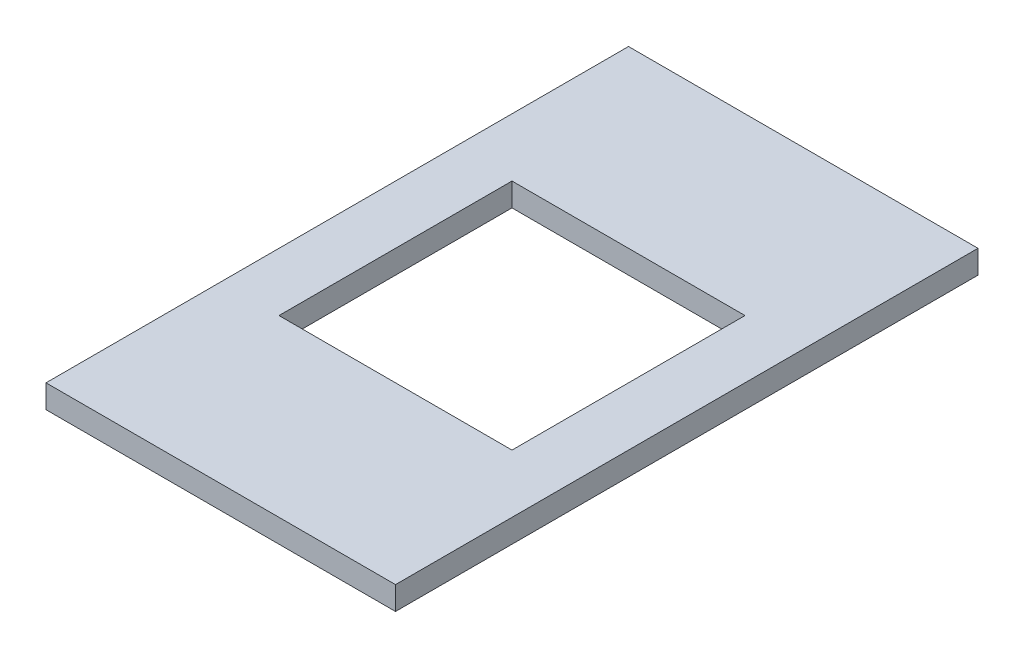
ISO-10303-21;
HEADER;
FILE_DESCRIPTION(('STEP AP214'),'2;1');
FILE_NAME('part.step','',(''),(''),'','','');
FILE_SCHEMA(('AUTOMOTIVE_DESIGN { 1 0 10303 214 1 1 1 1 }'));
ENDSEC;
DATA;
#1=APPLICATION_CONTEXT('core data for automotive mechanical design processes');
#2=APPLICATION_PROTOCOL_DEFINITION('international standard','automotive_design',2000,#1);
#3=PRODUCT_CONTEXT('',#1,'mechanical');
#4=PRODUCT('Part','Part','',(#3));
#5=PRODUCT_RELATED_PRODUCT_CATEGORY('part','',(#4));
#6=PRODUCT_DEFINITION_FORMATION('','',#4);
#7=PRODUCT_DEFINITION_CONTEXT('part definition',#1,'design');
#8=PRODUCT_DEFINITION('design','',#6,#7);
#9=PRODUCT_DEFINITION_SHAPE('','',#8);
#10=(LENGTH_UNIT() NAMED_UNIT(*) SI_UNIT(.MILLI.,.METRE.));
#11=(NAMED_UNIT(*) PLANE_ANGLE_UNIT() SI_UNIT($,.RADIAN.));
#12=(NAMED_UNIT(*) SI_UNIT($,.STERADIAN.) SOLID_ANGLE_UNIT());
#13=UNCERTAINTY_MEASURE_WITH_UNIT(LENGTH_MEASURE(1.E-05),#10,'distance_accuracy_value','');
#14=(GEOMETRIC_REPRESENTATION_CONTEXT(3) GLOBAL_UNCERTAINTY_ASSIGNED_CONTEXT((#13)) GLOBAL_UNIT_ASSIGNED_CONTEXT((#10,
#11,#12)) REPRESENTATION_CONTEXT('',''));
#15=CARTESIAN_POINT('',(0.,0.,0.));
#16=DIRECTION('',(0.,0.,1.));
#17=DIRECTION('',(1.,0.,0.));
#18=AXIS2_PLACEMENT_3D('',#15,#16,#17);
#19=CARTESIAN_POINT('',(0.,10.,0.));
#20=DIRECTION('',(-1.,0.,0.));
#21=DIRECTION('',(0.,0.,1.));
#22=AXIS2_PLACEMENT_3D('',#19,#20,#21);
#23=PLANE('',#22);
#24=DIRECTION('',(0.,0.,1.));
#25=VECTOR('',#24,1.);
#26=CARTESIAN_POINT('',(0.,0.,-140.));
#27=LINE('',#26,#25);
#28=CARTESIAN_POINT('',(0.,0.,-140.));
#29=VERTEX_POINT('',#28);
#30=CARTESIAN_POINT('',(0.,0.,110.));
#31=VERTEX_POINT('',#30);
#32=EDGE_CURVE('E39',#29,#31,#27,.T.);
#33=ORIENTED_EDGE('',*,*,#32,.T.);
#34=DIRECTION('',(0.,1.,0.));
#35=VECTOR('',#34,1.);
#36=CARTESIAN_POINT('',(0.,-10.,110.));
#37=LINE('',#36,#35);
#38=CARTESIAN_POINT('',(0.,-10.,110.));
#39=VERTEX_POINT('',#38);
#40=EDGE_CURVE('E158',#39,#31,#37,.T.);
#41=ORIENTED_EDGE('',*,*,#40,.F.);
#42=DIRECTION('',(0.,0.,1.));
#43=VECTOR('',#42,1.);
#44=CARTESIAN_POINT('',(0.,-10.,-140.));
#45=LINE('',#44,#43);
#46=CARTESIAN_POINT('',(0.,-10.,-140.));
#47=VERTEX_POINT('',#46);
#48=EDGE_CURVE('E144',#47,#39,#45,.T.);
#49=ORIENTED_EDGE('',*,*,#48,.F.);
#50=DIRECTION('',(0.,1.,0.));
#51=VECTOR('',#50,1.);
#52=CARTESIAN_POINT('',(0.,-10.,-140.));
#53=LINE('',#52,#51);
#54=EDGE_CURVE('E155',#47,#29,#53,.T.);
#55=ORIENTED_EDGE('',*,*,#54,.T.);
#56=EDGE_LOOP('',(#33,#41,#49,#55));
#57=FACE_BOUND('',#56,.T.);
#58=ADVANCED_FACE('F36',(#57),#23,.F.);
#59=CARTESIAN_POINT('',(-150.,10.,0.));
#60=DIRECTION('',(1.,0.,0.));
#61=DIRECTION('',(0.,0.,-1.));
#62=AXIS2_PLACEMENT_3D('',#59,#60,#61);
#63=PLANE('',#62);
#64=DIRECTION('',(0.,0.,-1.));
#65=VECTOR('',#64,1.);
#66=CARTESIAN_POINT('',(-150.,0.,-140.));
#67=LINE('',#66,#65);
#68=CARTESIAN_POINT('',(-150.,0.,110.));
#69=VERTEX_POINT('',#68);
#70=CARTESIAN_POINT('',(-150.,0.,-140.));
#71=VERTEX_POINT('',#70);
#72=EDGE_CURVE('E119',#69,#71,#67,.T.);
#73=ORIENTED_EDGE('',*,*,#72,.T.);
#74=DIRECTION('',(0.,1.,0.));
#75=VECTOR('',#74,1.);
#76=CARTESIAN_POINT('',(-150.,-10.,-140.));
#77=LINE('',#76,#75);
#78=CARTESIAN_POINT('',(-150.,-10.,-140.));
#79=VERTEX_POINT('',#78);
#80=EDGE_CURVE('E132',#79,#71,#77,.T.);
#81=ORIENTED_EDGE('',*,*,#80,.F.);
#82=DIRECTION('',(0.,0.,-1.));
#83=VECTOR('',#82,1.);
#84=CARTESIAN_POINT('',(-150.,-10.,-140.));
#85=LINE('',#84,#83);
#86=CARTESIAN_POINT('',(-150.,-10.,110.));
#87=VERTEX_POINT('',#86);
#88=EDGE_CURVE('E138',#87,#79,#85,.T.);
#89=ORIENTED_EDGE('',*,*,#88,.F.);
#90=DIRECTION('',(0.,1.,0.));
#91=VECTOR('',#90,1.);
#92=CARTESIAN_POINT('',(-150.,-10.,110.));
#93=LINE('',#92,#91);
#94=EDGE_CURVE('E148',#87,#69,#93,.T.);
#95=ORIENTED_EDGE('',*,*,#94,.T.);
#96=EDGE_LOOP('',(#73,#81,#89,#95));
#97=FACE_BOUND('',#96,.T.);
#98=ADVANCED_FACE('F180',(#97),#63,.F.);
#99=CARTESIAN_POINT('',(0.,0.,0.));
#100=DIRECTION('',(0.,-1.,0.));
#101=DIRECTION('',(0.,0.,-1.));
#102=AXIS2_PLACEMENT_3D('',#99,#100,#101);
#103=PLANE('',#102);
#104=DIRECTION('',(-1.,0.,0.));
#105=VECTOR('',#104,1.);
#106=CARTESIAN_POINT('',(-125.,0.,35.));
#107=LINE('',#106,#105);
#108=CARTESIAN_POINT('',(-25.,0.,35.));
#109=VERTEX_POINT('',#108);
#110=CARTESIAN_POINT('',(-125.,0.,35.));
#111=VERTEX_POINT('',#110);
#112=EDGE_CURVE('E118',#109,#111,#107,.T.);
#113=ORIENTED_EDGE('',*,*,#112,.T.);
#114=DIRECTION('',(0.,0.,-1.));
#115=VECTOR('',#114,1.);
#116=CARTESIAN_POINT('',(-125.,0.,-65.));
#117=LINE('',#116,#115);
#118=CARTESIAN_POINT('',(-125.,0.,-65.));
#119=VERTEX_POINT('',#118);
#120=EDGE_CURVE('E45',#111,#119,#117,.T.);
#121=ORIENTED_EDGE('',*,*,#120,.T.);
#122=DIRECTION('',(1.,0.,0.));
#123=VECTOR('',#122,1.);
#124=CARTESIAN_POINT('',(-125.,0.,-65.));
#125=LINE('',#124,#123);
#126=CARTESIAN_POINT('',(-25.,0.,-65.));
#127=VERTEX_POINT('',#126);
#128=EDGE_CURVE('E110',#119,#127,#125,.T.);
#129=ORIENTED_EDGE('',*,*,#128,.T.);
#130=DIRECTION('',(0.,0.,1.));
#131=VECTOR('',#130,1.);
#132=CARTESIAN_POINT('',(-25.,0.,-65.));
#133=LINE('',#132,#131);
#134=EDGE_CURVE('E11',#127,#109,#133,.T.);
#135=ORIENTED_EDGE('',*,*,#134,.T.);
#136=EDGE_LOOP('',(#113,#121,#129,#135));
#137=FACE_BOUND('',#136,.T.);
#138=DIRECTION('',(1.,0.,0.));
#139=VECTOR('',#138,1.);
#140=CARTESIAN_POINT('',(0.,0.,-140.));
#141=LINE('',#140,#139);
#142=EDGE_CURVE('E151',#71,#29,#141,.T.);
#143=ORIENTED_EDGE('',*,*,#142,.F.);
#144=ORIENTED_EDGE('',*,*,#72,.F.);
#145=DIRECTION('',(-1.,0.,0.));
#146=VECTOR('',#145,1.);
#147=CARTESIAN_POINT('',(0.,0.,110.));
#148=LINE('',#147,#146);
#149=EDGE_CURVE('E142',#31,#69,#148,.T.);
#150=ORIENTED_EDGE('',*,*,#149,.F.);
#151=ORIENTED_EDGE('',*,*,#32,.F.);
#152=EDGE_LOOP('',(#143,#144,#150,#151));
#153=FACE_BOUND('',#152,.T.);
#154=ADVANCED_FACE('F178',(#137,#153),#103,.F.);
#155=CARTESIAN_POINT('',(0.,-10.,0.));
#156=DIRECTION('',(0.,-1.,0.));
#157=DIRECTION('',(0.,0.,-1.));
#158=AXIS2_PLACEMENT_3D('',#155,#156,#157);
#159=PLANE('',#158);
#160=ORIENTED_EDGE('',*,*,#88,.T.);
#161=DIRECTION('',(1.,0.,0.));
#162=VECTOR('',#161,1.);
#163=CARTESIAN_POINT('',(0.,-10.,-140.));
#164=LINE('',#163,#162);
#165=EDGE_CURVE('E141',#79,#47,#164,.T.);
#166=ORIENTED_EDGE('',*,*,#165,.T.);
#167=ORIENTED_EDGE('',*,*,#48,.T.);
#168=DIRECTION('',(-1.,0.,0.));
#169=VECTOR('',#168,1.);
#170=CARTESIAN_POINT('',(0.,-10.,110.));
#171=LINE('',#170,#169);
#172=EDGE_CURVE('E146',#39,#87,#171,.T.);
#173=ORIENTED_EDGE('',*,*,#172,.T.);
#174=EDGE_LOOP('',(#160,#166,#167,#173));
#175=FACE_BOUND('',#174,.T.);
#176=DIRECTION('',(-1.,0.,0.));
#177=VECTOR('',#176,1.);
#178=CARTESIAN_POINT('',(-125.,-10.,35.));
#179=LINE('',#178,#177);
#180=CARTESIAN_POINT('',(-25.,-10.,35.));
#181=VERTEX_POINT('',#180);
#182=CARTESIAN_POINT('',(-125.,-10.,35.));
#183=VERTEX_POINT('',#182);
#184=EDGE_CURVE('E109',#181,#183,#179,.T.);
#185=ORIENTED_EDGE('',*,*,#184,.F.);
#186=DIRECTION('',(0.,0.,1.));
#187=VECTOR('',#186,1.);
#188=CARTESIAN_POINT('',(-25.,-10.,-65.));
#189=LINE('',#188,#187);
#190=CARTESIAN_POINT('',(-25.,-10.,-65.));
#191=VERTEX_POINT('',#190);
#192=EDGE_CURVE('E101',#191,#181,#189,.T.);
#193=ORIENTED_EDGE('',*,*,#192,.F.);
#194=DIRECTION('',(1.,0.,0.));
#195=VECTOR('',#194,1.);
#196=CARTESIAN_POINT('',(-125.,-10.,-65.));
#197=LINE('',#196,#195);
#198=CARTESIAN_POINT('',(-125.,-10.,-65.));
#199=VERTEX_POINT('',#198);
#200=EDGE_CURVE('E126',#199,#191,#197,.T.);
#201=ORIENTED_EDGE('',*,*,#200,.F.);
#202=DIRECTION('',(0.,0.,-1.));
#203=VECTOR('',#202,1.);
#204=CARTESIAN_POINT('',(-125.,-10.,-65.));
#205=LINE('',#204,#203);
#206=EDGE_CURVE('E124',#183,#199,#205,.T.);
#207=ORIENTED_EDGE('',*,*,#206,.F.);
#208=EDGE_LOOP('',(#185,#193,#201,#207));
#209=FACE_BOUND('',#208,.T.);
#210=ADVANCED_FACE('F123',(#175,#209),#159,.T.);
#211=CARTESIAN_POINT('',(0.,-10.,-140.));
#212=DIRECTION('',(0.,0.,1.));
#213=DIRECTION('',(1.,0.,0.));
#214=AXIS2_PLACEMENT_3D('',#211,#212,#213);
#215=PLANE('',#214);
#216=ORIENTED_EDGE('',*,*,#142,.T.);
#217=ORIENTED_EDGE('',*,*,#54,.F.);
#218=ORIENTED_EDGE('',*,*,#165,.F.);
#219=ORIENTED_EDGE('',*,*,#80,.T.);
#220=EDGE_LOOP('',(#216,#217,#218,#219));
#221=FACE_BOUND('',#220,.T.);
#222=ADVANCED_FACE('F173',(#221),#215,.F.);
#223=CARTESIAN_POINT('',(0.,-10.,110.));
#224=DIRECTION('',(0.,0.,-1.));
#225=DIRECTION('',(-1.,0.,0.));
#226=AXIS2_PLACEMENT_3D('',#223,#224,#225);
#227=PLANE('',#226);
#228=ORIENTED_EDGE('',*,*,#149,.T.);
#229=ORIENTED_EDGE('',*,*,#94,.F.);
#230=ORIENTED_EDGE('',*,*,#172,.F.);
#231=ORIENTED_EDGE('',*,*,#40,.T.);
#232=EDGE_LOOP('',(#228,#229,#230,#231));
#233=FACE_BOUND('',#232,.T.);
#234=ADVANCED_FACE('F183',(#233),#227,.F.);
#235=CARTESIAN_POINT('',(-25.,-10.,-65.));
#236=DIRECTION('',(-1.,0.,0.));
#237=DIRECTION('',(0.,0.,1.));
#238=AXIS2_PLACEMENT_3D('',#235,#236,#237);
#239=PLANE('',#238);
#240=ORIENTED_EDGE('',*,*,#134,.F.);
#241=DIRECTION('',(0.,1.,0.));
#242=VECTOR('',#241,1.);
#243=CARTESIAN_POINT('',(-25.,-10.,-65.));
#244=LINE('',#243,#242);
#245=EDGE_CURVE('E105',#191,#127,#244,.T.);
#246=ORIENTED_EDGE('',*,*,#245,.F.);
#247=ORIENTED_EDGE('',*,*,#192,.T.);
#248=DIRECTION('',(0.,1.,0.));
#249=VECTOR('',#248,1.);
#250=CARTESIAN_POINT('',(-25.,-10.,35.));
#251=LINE('',#250,#249);
#252=EDGE_CURVE('E104',#181,#109,#251,.T.);
#253=ORIENTED_EDGE('',*,*,#252,.T.);
#254=EDGE_LOOP('',(#240,#246,#247,#253));
#255=FACE_BOUND('',#254,.T.);
#256=ADVANCED_FACE('F103',(#255),#239,.T.);
#257=CARTESIAN_POINT('',(-125.,-10.,35.));
#258=DIRECTION('',(0.,0.,-1.));
#259=DIRECTION('',(-1.,0.,0.));
#260=AXIS2_PLACEMENT_3D('',#257,#258,#259);
#261=PLANE('',#260);
#262=ORIENTED_EDGE('',*,*,#112,.F.);
#263=ORIENTED_EDGE('',*,*,#252,.F.);
#264=ORIENTED_EDGE('',*,*,#184,.T.);
#265=DIRECTION('',(0.,1.,0.));
#266=VECTOR('',#265,1.);
#267=CARTESIAN_POINT('',(-125.,-10.,35.));
#268=LINE('',#267,#266);
#269=EDGE_CURVE('E120',#183,#111,#268,.T.);
#270=ORIENTED_EDGE('',*,*,#269,.T.);
#271=EDGE_LOOP('',(#262,#263,#264,#270));
#272=FACE_BOUND('',#271,.T.);
#273=ADVANCED_FACE('F114',(#272),#261,.T.);
#274=CARTESIAN_POINT('',(-125.,-10.,-65.));
#275=DIRECTION('',(1.,0.,0.));
#276=DIRECTION('',(0.,0.,-1.));
#277=AXIS2_PLACEMENT_3D('',#274,#275,#276);
#278=PLANE('',#277);
#279=ORIENTED_EDGE('',*,*,#120,.F.);
#280=ORIENTED_EDGE('',*,*,#269,.F.);
#281=ORIENTED_EDGE('',*,*,#206,.T.);
#282=DIRECTION('',(0.,1.,0.));
#283=VECTOR('',#282,1.);
#284=CARTESIAN_POINT('',(-125.,-10.,-65.));
#285=LINE('',#284,#283);
#286=EDGE_CURVE('E53',#199,#119,#285,.T.);
#287=ORIENTED_EDGE('',*,*,#286,.T.);
#288=EDGE_LOOP('',(#279,#280,#281,#287));
#289=FACE_BOUND('',#288,.T.);
#290=ADVANCED_FACE('F209',(#289),#278,.T.);
#291=CARTESIAN_POINT('',(-125.,-10.,-65.));
#292=DIRECTION('',(0.,0.,1.));
#293=DIRECTION('',(1.,0.,0.));
#294=AXIS2_PLACEMENT_3D('',#291,#292,#293);
#295=PLANE('',#294);
#296=ORIENTED_EDGE('',*,*,#128,.F.);
#297=ORIENTED_EDGE('',*,*,#286,.F.);
#298=ORIENTED_EDGE('',*,*,#200,.T.);
#299=ORIENTED_EDGE('',*,*,#245,.T.);
#300=EDGE_LOOP('',(#296,#297,#298,#299));
#301=FACE_BOUND('',#300,.T.);
#302=ADVANCED_FACE('F214',(#301),#295,.T.);
#303=CLOSED_SHELL('',(#58,#98,#154,#210,#222,#234,#256,#273,#290,#302));
#304=MANIFOLD_SOLID_BREP('B2',#303);
#305=ADVANCED_BREP_SHAPE_REPRESENTATION('',(#18,#304),#14);
#306=SHAPE_DEFINITION_REPRESENTATION(#9,#305);
ENDSEC;
END-ISO-10303-21;
